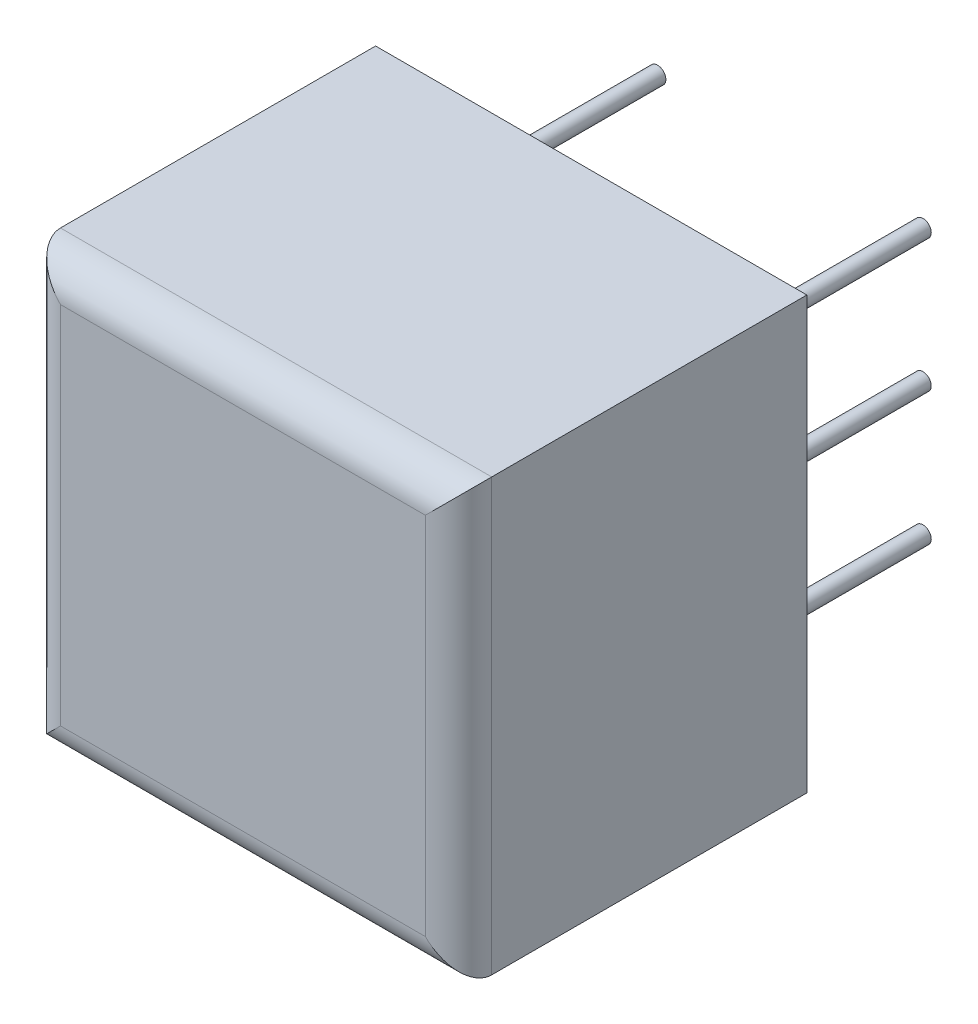
ISO-10303-21;
HEADER;
FILE_DESCRIPTION(('STEP AP214'),'2;1');
FILE_NAME('part.step','',(''),(''),'','','');
FILE_SCHEMA(('AUTOMOTIVE_DESIGN { 1 0 10303 214 1 1 1 1 }'));
ENDSEC;
DATA;
#1=APPLICATION_CONTEXT('core data for automotive mechanical design processes');
#2=APPLICATION_PROTOCOL_DEFINITION('international standard','automotive_design',2000,#1);
#3=PRODUCT_CONTEXT('',#1,'mechanical');
#4=PRODUCT('Part','Part','',(#3));
#5=PRODUCT_RELATED_PRODUCT_CATEGORY('part','',(#4));
#6=PRODUCT_DEFINITION_FORMATION('','',#4);
#7=PRODUCT_DEFINITION_CONTEXT('part definition',#1,'design');
#8=PRODUCT_DEFINITION('design','',#6,#7);
#9=PRODUCT_DEFINITION_SHAPE('','',#8);
#10=(LENGTH_UNIT() NAMED_UNIT(*) SI_UNIT(.MILLI.,.METRE.));
#11=(NAMED_UNIT(*) PLANE_ANGLE_UNIT() SI_UNIT($,.RADIAN.));
#12=(NAMED_UNIT(*) SI_UNIT($,.STERADIAN.) SOLID_ANGLE_UNIT());
#13=UNCERTAINTY_MEASURE_WITH_UNIT(LENGTH_MEASURE(1.E-05),#10,'distance_accuracy_value','');
#14=(GEOMETRIC_REPRESENTATION_CONTEXT(3) GLOBAL_UNCERTAINTY_ASSIGNED_CONTEXT((#13)) GLOBAL_UNIT_ASSIGNED_CONTEXT((#10,
#11,#12)) REPRESENTATION_CONTEXT('',''));
#15=CARTESIAN_POINT('',(0.,0.,0.));
#16=DIRECTION('',(0.,0.,1.));
#17=DIRECTION('',(1.,0.,0.));
#18=AXIS2_PLACEMENT_3D('',#15,#16,#17);
#19=CARTESIAN_POINT('',(0.,0.,0.));
#20=DIRECTION('',(0.,0.,1.));
#21=DIRECTION('',(1.,0.,0.));
#22=AXIS2_PLACEMENT_3D('',#19,#20,#21);
#23=PLANE('',#22);
#24=CARTESIAN_POINT('',(-8.,-8.,0.));
#25=DIRECTION('',(0.,0.,1.));
#26=DIRECTION('',(1.,0.,0.));
#27=AXIS2_PLACEMENT_3D('',#24,#25,#26);
#28=CIRCLE('',#27,0.500000000000001);
#29=CARTESIAN_POINT('',(-7.5,-8.,0.));
#30=VERTEX_POINT('',#29);
#31=EDGE_CURVE('E41',#30,#30,#28,.F.);
#32=ORIENTED_EDGE('',*,*,#31,.F.);
#33=EDGE_LOOP('',(#32));
#34=FACE_BOUND('',#33,.T.);
#35=CARTESIAN_POINT('',(8.,0.,0.));
#36=DIRECTION('',(0.,0.,1.));
#37=DIRECTION('',(1.,0.,0.));
#38=AXIS2_PLACEMENT_3D('',#35,#36,#37);
#39=CIRCLE('',#38,0.500000000000001);
#40=CARTESIAN_POINT('',(8.5,0.,0.));
#41=VERTEX_POINT('',#40);
#42=EDGE_CURVE('E145',#41,#41,#39,.F.);
#43=ORIENTED_EDGE('',*,*,#42,.F.);
#44=EDGE_LOOP('',(#43));
#45=FACE_BOUND('',#44,.T.);
#46=DIRECTION('',(0.,-1.,0.));
#47=VECTOR('',#46,1.);
#48=CARTESIAN_POINT('',(-13.,13.,0.));
#49=LINE('',#48,#47);
#50=CARTESIAN_POINT('',(-13.,13.,0.));
#51=VERTEX_POINT('',#50);
#52=CARTESIAN_POINT('',(-13.,-13.,0.));
#53=VERTEX_POINT('',#52);
#54=EDGE_CURVE('E98',#51,#53,#49,.T.);
#55=ORIENTED_EDGE('',*,*,#54,.F.);
#56=DIRECTION('',(-1.,0.,0.));
#57=VECTOR('',#56,1.);
#58=CARTESIAN_POINT('',(-13.,13.,0.));
#59=LINE('',#58,#57);
#60=CARTESIAN_POINT('',(13.,13.,0.));
#61=VERTEX_POINT('',#60);
#62=EDGE_CURVE('E115',#61,#51,#59,.T.);
#63=ORIENTED_EDGE('',*,*,#62,.F.);
#64=DIRECTION('',(0.,1.,0.));
#65=VECTOR('',#64,1.);
#66=CARTESIAN_POINT('',(13.,13.,0.));
#67=LINE('',#66,#65);
#68=CARTESIAN_POINT('',(13.,-13.,0.));
#69=VERTEX_POINT('',#68);
#70=EDGE_CURVE('E100',#69,#61,#67,.T.);
#71=ORIENTED_EDGE('',*,*,#70,.F.);
#72=DIRECTION('',(1.,0.,0.));
#73=VECTOR('',#72,1.);
#74=CARTESIAN_POINT('',(-13.,-13.,0.));
#75=LINE('',#74,#73);
#76=EDGE_CURVE('E88',#53,#69,#75,.T.);
#77=ORIENTED_EDGE('',*,*,#76,.F.);
#78=EDGE_LOOP('',(#55,#63,#71,#77));
#79=FACE_BOUND('',#78,.T.);
#80=CARTESIAN_POINT('',(8.,8.,0.));
#81=DIRECTION('',(0.,0.,1.));
#82=DIRECTION('',(1.,0.,0.));
#83=AXIS2_PLACEMENT_3D('',#80,#81,#82);
#84=CIRCLE('',#83,0.500000000000001);
#85=CARTESIAN_POINT('',(8.5,8.,0.));
#86=VERTEX_POINT('',#85);
#87=EDGE_CURVE('E136',#86,#86,#84,.F.);
#88=ORIENTED_EDGE('',*,*,#87,.F.);
#89=EDGE_LOOP('',(#88));
#90=FACE_BOUND('',#89,.T.);
#91=CARTESIAN_POINT('',(8.,-8.,0.));
#92=DIRECTION('',(0.,0.,1.));
#93=DIRECTION('',(1.,0.,0.));
#94=AXIS2_PLACEMENT_3D('',#91,#92,#93);
#95=CIRCLE('',#94,0.500000000000001);
#96=CARTESIAN_POINT('',(8.5,-8.,0.));
#97=VERTEX_POINT('',#96);
#98=EDGE_CURVE('E148',#97,#97,#95,.F.);
#99=ORIENTED_EDGE('',*,*,#98,.F.);
#100=EDGE_LOOP('',(#99));
#101=FACE_BOUND('',#100,.T.);
#102=CARTESIAN_POINT('',(-8.,8.,0.));
#103=DIRECTION('',(0.,0.,1.));
#104=DIRECTION('',(1.,0.,0.));
#105=AXIS2_PLACEMENT_3D('',#102,#103,#104);
#106=CIRCLE('',#105,0.500000000000001);
#107=CARTESIAN_POINT('',(-7.5,8.,0.));
#108=VERTEX_POINT('',#107);
#109=EDGE_CURVE('E11',#108,#108,#106,.F.);
#110=ORIENTED_EDGE('',*,*,#109,.F.);
#111=EDGE_LOOP('',(#110));
#112=FACE_BOUND('',#111,.T.);
#113=ADVANCED_FACE('F33',(#34,#45,#79,#90,#101,#112),#23,.F.);
#114=CARTESIAN_POINT('',(-13.,13.,21.));
#115=DIRECTION('',(1.,0.,0.));
#116=DIRECTION('',(0.,1.,0.));
#117=AXIS2_PLACEMENT_3D('',#114,#115,#116);
#118=PLANE('',#117);
#119=DIRECTION('',(0.,0.,-1.));
#120=VECTOR('',#119,1.);
#121=CARTESIAN_POINT('',(-13.,-13.,21.));
#122=LINE('',#121,#120);
#123=CARTESIAN_POINT('',(-13.,-13.,19.));
#124=VERTEX_POINT('',#123);
#125=EDGE_CURVE('E85',#124,#53,#122,.T.);
#126=ORIENTED_EDGE('',*,*,#125,.F.);
#127=DIRECTION('',(0.,-1.,0.));
#128=VECTOR('',#127,1.);
#129=CARTESIAN_POINT('',(-13.,13.,19.));
#130=LINE('',#129,#128);
#131=CARTESIAN_POINT('',(-13.,13.,19.));
#132=VERTEX_POINT('',#131);
#133=EDGE_CURVE('E55',#124,#132,#130,.F.);
#134=ORIENTED_EDGE('',*,*,#133,.T.);
#135=DIRECTION('',(0.,0.,-1.));
#136=VECTOR('',#135,1.);
#137=CARTESIAN_POINT('',(-13.,13.,21.));
#138=LINE('',#137,#136);
#139=EDGE_CURVE('E103',#132,#51,#138,.T.);
#140=ORIENTED_EDGE('',*,*,#139,.T.);
#141=ORIENTED_EDGE('',*,*,#54,.T.);
#142=EDGE_LOOP('',(#126,#134,#140,#141));
#143=FACE_BOUND('',#142,.T.);
#144=ADVANCED_FACE('F102',(#143),#118,.F.);
#145=CARTESIAN_POINT('',(-13.,-13.,21.));
#146=DIRECTION('',(0.,1.,0.));
#147=DIRECTION('',(-1.,0.,0.));
#148=AXIS2_PLACEMENT_3D('',#145,#146,#147);
#149=PLANE('',#148);
#150=DIRECTION('',(0.,0.,-1.));
#151=VECTOR('',#150,1.);
#152=CARTESIAN_POINT('',(13.,-13.,21.));
#153=LINE('',#152,#151);
#154=CARTESIAN_POINT('',(13.,-13.,19.));
#155=VERTEX_POINT('',#154);
#156=EDGE_CURVE('E92',#155,#69,#153,.T.);
#157=ORIENTED_EDGE('',*,*,#156,.F.);
#158=DIRECTION('',(1.,0.,0.));
#159=VECTOR('',#158,1.);
#160=CARTESIAN_POINT('',(-13.,-13.,19.));
#161=LINE('',#160,#159);
#162=EDGE_CURVE('E48',#155,#124,#161,.F.);
#163=ORIENTED_EDGE('',*,*,#162,.T.);
#164=ORIENTED_EDGE('',*,*,#125,.T.);
#165=ORIENTED_EDGE('',*,*,#76,.T.);
#166=EDGE_LOOP('',(#157,#163,#164,#165));
#167=FACE_BOUND('',#166,.T.);
#168=ADVANCED_FACE('F87',(#167),#149,.F.);
#169=CARTESIAN_POINT('',(13.,13.,21.));
#170=DIRECTION('',(-1.,0.,0.));
#171=DIRECTION('',(0.,-1.,0.));
#172=AXIS2_PLACEMENT_3D('',#169,#170,#171);
#173=PLANE('',#172);
#174=DIRECTION('',(0.,0.,-1.));
#175=VECTOR('',#174,1.);
#176=CARTESIAN_POINT('',(13.,13.,21.));
#177=LINE('',#176,#175);
#178=CARTESIAN_POINT('',(13.,13.,19.));
#179=VERTEX_POINT('',#178);
#180=EDGE_CURVE('E118',#179,#61,#177,.T.);
#181=ORIENTED_EDGE('',*,*,#180,.F.);
#182=DIRECTION('',(0.,1.,0.));
#183=VECTOR('',#182,1.);
#184=CARTESIAN_POINT('',(13.,-13.,19.));
#185=LINE('',#184,#183);
#186=EDGE_CURVE('E129',#179,#155,#185,.F.);
#187=ORIENTED_EDGE('',*,*,#186,.T.);
#188=ORIENTED_EDGE('',*,*,#156,.T.);
#189=ORIENTED_EDGE('',*,*,#70,.T.);
#190=EDGE_LOOP('',(#181,#187,#188,#189));
#191=FACE_BOUND('',#190,.T.);
#192=ADVANCED_FACE('F190',(#191),#173,.F.);
#193=CARTESIAN_POINT('',(-13.,13.,21.));
#194=DIRECTION('',(0.,-1.,0.));
#195=DIRECTION('',(1.,0.,0.));
#196=AXIS2_PLACEMENT_3D('',#193,#194,#195);
#197=PLANE('',#196);
#198=ORIENTED_EDGE('',*,*,#139,.F.);
#199=DIRECTION('',(-1.,0.,0.));
#200=VECTOR('',#199,1.);
#201=CARTESIAN_POINT('',(13.,13.,19.));
#202=LINE('',#201,#200);
#203=EDGE_CURVE('E132',#132,#179,#202,.F.);
#204=ORIENTED_EDGE('',*,*,#203,.T.);
#205=ORIENTED_EDGE('',*,*,#180,.T.);
#206=ORIENTED_EDGE('',*,*,#62,.T.);
#207=EDGE_LOOP('',(#198,#204,#205,#206));
#208=FACE_BOUND('',#207,.T.);
#209=ADVANCED_FACE('F185',(#208),#197,.F.);
#210=CARTESIAN_POINT('',(0.,0.,21.));
#211=DIRECTION('',(0.,0.,1.));
#212=DIRECTION('',(1.,0.,0.));
#213=AXIS2_PLACEMENT_3D('',#210,#211,#212);
#214=PLANE('',#213);
#215=DIRECTION('',(1.,0.,0.));
#216=VECTOR('',#215,1.);
#217=CARTESIAN_POINT('',(13.,-11.,21.));
#218=LINE('',#217,#216);
#219=CARTESIAN_POINT('',(-11.,-11.,21.));
#220=VERTEX_POINT('',#219);
#221=CARTESIAN_POINT('',(11.,-11.,21.));
#222=VERTEX_POINT('',#221);
#223=EDGE_CURVE('E91',#220,#222,#218,.T.);
#224=ORIENTED_EDGE('',*,*,#223,.T.);
#225=DIRECTION('',(0.,1.,0.));
#226=VECTOR('',#225,1.);
#227=CARTESIAN_POINT('',(11.,13.,21.));
#228=LINE('',#227,#226);
#229=CARTESIAN_POINT('',(11.,11.,21.));
#230=VERTEX_POINT('',#229);
#231=EDGE_CURVE('E126',#222,#230,#228,.T.);
#232=ORIENTED_EDGE('',*,*,#231,.T.);
#233=DIRECTION('',(-1.,0.,0.));
#234=VECTOR('',#233,1.);
#235=CARTESIAN_POINT('',(-13.,11.,21.));
#236=LINE('',#235,#234);
#237=CARTESIAN_POINT('',(-11.,11.,21.));
#238=VERTEX_POINT('',#237);
#239=EDGE_CURVE('E124',#230,#238,#236,.T.);
#240=ORIENTED_EDGE('',*,*,#239,.T.);
#241=DIRECTION('',(0.,-1.,0.));
#242=VECTOR('',#241,1.);
#243=CARTESIAN_POINT('',(-11.,-13.,21.));
#244=LINE('',#243,#242);
#245=EDGE_CURVE('E122',#238,#220,#244,.T.);
#246=ORIENTED_EDGE('',*,*,#245,.T.);
#247=EDGE_LOOP('',(#224,#232,#240,#246));
#248=FACE_BOUND('',#247,.T.);
#249=ADVANCED_FACE('F183',(#248),#214,.T.);
#250=CARTESIAN_POINT('',(-11.,0.,19.));
#251=DIRECTION('',(0.,1.,0.));
#252=DIRECTION('',(-1.,0.,0.));
#253=AXIS2_PLACEMENT_3D('',#250,#251,#252);
#254=CYLINDRICAL_SURFACE('',#253,2.);
#255=CARTESIAN_POINT('',(-11.,11.,19.));
#256=DIRECTION('',(0.707106781186547,0.707106781186548,0.));
#257=DIRECTION('',(-0.707106781186548,0.707106781186547,0.));
#258=AXIS2_PLACEMENT_3D('',#255,#256,#257);
#259=ELLIPSE('',#258,2.82842712474619,2.);
#260=EDGE_CURVE('E108',#132,#238,#259,.T.);
#261=ORIENTED_EDGE('',*,*,#260,.F.);
#262=ORIENTED_EDGE('',*,*,#133,.F.);
#263=CARTESIAN_POINT('',(-11.,-11.,19.));
#264=DIRECTION('',(-0.707106781186548,0.707106781186547,0.));
#265=DIRECTION('',(-0.707106781186547,-0.707106781186548,0.));
#266=AXIS2_PLACEMENT_3D('',#263,#264,#265);
#267=ELLIPSE('',#266,2.82842712474619,2.);
#268=EDGE_CURVE('E105',#220,#124,#267,.F.);
#269=ORIENTED_EDGE('',*,*,#268,.F.);
#270=ORIENTED_EDGE('',*,*,#245,.F.);
#271=EDGE_LOOP('',(#261,#262,#269,#270));
#272=FACE_BOUND('',#271,.T.);
#273=ADVANCED_FACE('F35',(#272),#254,.T.);
#274=CARTESIAN_POINT('',(0.,-11.,19.));
#275=DIRECTION('',(-1.,0.,0.));
#276=DIRECTION('',(0.,-1.,0.));
#277=AXIS2_PLACEMENT_3D('',#274,#275,#276);
#278=CYLINDRICAL_SURFACE('',#277,2.);
#279=ORIENTED_EDGE('',*,*,#268,.T.);
#280=ORIENTED_EDGE('',*,*,#162,.F.);
#281=CARTESIAN_POINT('',(11.,-11.,19.));
#282=DIRECTION('',(-0.707106781186547,-0.707106781186548,0.));
#283=DIRECTION('',(-0.707106781186548,0.707106781186547,0.));
#284=AXIS2_PLACEMENT_3D('',#281,#282,#283);
#285=ELLIPSE('',#284,2.82842712474619,2.);
#286=EDGE_CURVE('E139',#222,#155,#285,.F.);
#287=ORIENTED_EDGE('',*,*,#286,.F.);
#288=ORIENTED_EDGE('',*,*,#223,.F.);
#289=EDGE_LOOP('',(#279,#280,#287,#288));
#290=FACE_BOUND('',#289,.T.);
#291=ADVANCED_FACE('F204',(#290),#278,.T.);
#292=CARTESIAN_POINT('',(0.,11.,19.));
#293=DIRECTION('',(1.,0.,0.));
#294=DIRECTION('',(0.,1.,0.));
#295=AXIS2_PLACEMENT_3D('',#292,#293,#294);
#296=CYLINDRICAL_SURFACE('',#295,2.);
#297=ORIENTED_EDGE('',*,*,#260,.T.);
#298=ORIENTED_EDGE('',*,*,#239,.F.);
#299=CARTESIAN_POINT('',(11.,11.,19.));
#300=DIRECTION('',(0.707106781186548,-0.707106781186547,0.));
#301=DIRECTION('',(0.707106781186547,0.707106781186548,0.));
#302=AXIS2_PLACEMENT_3D('',#299,#300,#301);
#303=ELLIPSE('',#302,2.82842712474619,2.);
#304=EDGE_CURVE('E137',#179,#230,#303,.T.);
#305=ORIENTED_EDGE('',*,*,#304,.F.);
#306=ORIENTED_EDGE('',*,*,#203,.F.);
#307=EDGE_LOOP('',(#297,#298,#305,#306));
#308=FACE_BOUND('',#307,.T.);
#309=ADVANCED_FACE('F201',(#308),#296,.T.);
#310=CARTESIAN_POINT('',(11.,0.,19.));
#311=DIRECTION('',(0.,-1.,0.));
#312=DIRECTION('',(1.,0.,0.));
#313=AXIS2_PLACEMENT_3D('',#310,#311,#312);
#314=CYLINDRICAL_SURFACE('',#313,2.);
#315=ORIENTED_EDGE('',*,*,#286,.T.);
#316=ORIENTED_EDGE('',*,*,#186,.F.);
#317=ORIENTED_EDGE('',*,*,#304,.T.);
#318=ORIENTED_EDGE('',*,*,#231,.F.);
#319=EDGE_LOOP('',(#315,#316,#317,#318));
#320=FACE_BOUND('',#319,.T.);
#321=ADVANCED_FACE('F181',(#320),#314,.T.);
#322=CARTESIAN_POINT('',(8.,8.,-12.));
#323=DIRECTION('',(0.,0.,1.));
#324=DIRECTION('',(1.,0.,0.));
#325=AXIS2_PLACEMENT_3D('',#322,#323,#324);
#326=CYLINDRICAL_SURFACE('',#325,0.500000000000001);
#327=CARTESIAN_POINT('',(8.,8.,-12.));
#328=DIRECTION('',(0.,0.,-1.));
#329=DIRECTION('',(-1.,0.,0.));
#330=AXIS2_PLACEMENT_3D('',#327,#328,#329);
#331=CIRCLE('',#330,0.500000000000001);
#332=CARTESIAN_POINT('',(7.5,8.,-12.));
#333=VERTEX_POINT('',#332);
#334=EDGE_CURVE('E111',#333,#333,#331,.T.);
#335=ORIENTED_EDGE('',*,*,#334,.F.);
#336=EDGE_LOOP('',(#335));
#337=FACE_BOUND('',#336,.T.);
#338=ORIENTED_EDGE('',*,*,#87,.T.);
#339=EDGE_LOOP('',(#338));
#340=FACE_BOUND('',#339,.T.);
#341=ADVANCED_FACE('F173',(#337,#340),#326,.T.);
#342=CARTESIAN_POINT('',(8.,8.,-12.));
#343=DIRECTION('',(0.,0.,-1.));
#344=DIRECTION('',(-1.,0.,0.));
#345=AXIS2_PLACEMENT_3D('',#342,#343,#344);
#346=PLANE('',#345);
#347=ORIENTED_EDGE('',*,*,#334,.T.);
#348=EDGE_LOOP('',(#347));
#349=FACE_BOUND('',#348,.T.);
#350=ADVANCED_FACE('F163',(#349),#346,.T.);
#351=CARTESIAN_POINT('',(8.,0.,-12.));
#352=DIRECTION('',(0.,0.,1.));
#353=DIRECTION('',(1.,0.,0.));
#354=AXIS2_PLACEMENT_3D('',#351,#352,#353);
#355=CYLINDRICAL_SURFACE('',#354,0.500000000000001);
#356=CARTESIAN_POINT('',(8.,0.,-12.));
#357=DIRECTION('',(0.,0.,-1.));
#358=DIRECTION('',(-1.,0.,0.));
#359=AXIS2_PLACEMENT_3D('',#356,#357,#358);
#360=CIRCLE('',#359,0.500000000000001);
#361=CARTESIAN_POINT('',(7.5,0.,-12.));
#362=VERTEX_POINT('',#361);
#363=EDGE_CURVE('E366',#362,#362,#360,.T.);
#364=ORIENTED_EDGE('',*,*,#363,.F.);
#365=EDGE_LOOP('',(#364));
#366=FACE_BOUND('',#365,.T.);
#367=ORIENTED_EDGE('',*,*,#42,.T.);
#368=EDGE_LOOP('',(#367));
#369=FACE_BOUND('',#368,.T.);
#370=ADVANCED_FACE('F160',(#366,#369),#355,.T.);
#371=CARTESIAN_POINT('',(8.,0.,-12.));
#372=DIRECTION('',(0.,0.,-1.));
#373=DIRECTION('',(-1.,0.,0.));
#374=AXIS2_PLACEMENT_3D('',#371,#372,#373);
#375=PLANE('',#374);
#376=ORIENTED_EDGE('',*,*,#363,.T.);
#377=EDGE_LOOP('',(#376));
#378=FACE_BOUND('',#377,.T.);
#379=ADVANCED_FACE('F162',(#378),#375,.T.);
#380=CARTESIAN_POINT('',(8.,-8.,-12.));
#381=DIRECTION('',(0.,0.,1.));
#382=DIRECTION('',(1.,0.,0.));
#383=AXIS2_PLACEMENT_3D('',#380,#381,#382);
#384=CYLINDRICAL_SURFACE('',#383,0.500000000000001);
#385=CARTESIAN_POINT('',(8.,-8.,-12.));
#386=DIRECTION('',(0.,0.,-1.));
#387=DIRECTION('',(1.,0.,0.));
#388=AXIS2_PLACEMENT_3D('',#385,#386,#387);
#389=CIRCLE('',#388,0.500000000000001);
#390=CARTESIAN_POINT('',(8.5,-8.,-12.));
#391=VERTEX_POINT('',#390);
#392=EDGE_CURVE('E362',#391,#391,#389,.T.);
#393=ORIENTED_EDGE('',*,*,#392,.F.);
#394=EDGE_LOOP('',(#393));
#395=FACE_BOUND('',#394,.T.);
#396=ORIENTED_EDGE('',*,*,#98,.T.);
#397=EDGE_LOOP('',(#396));
#398=FACE_BOUND('',#397,.T.);
#399=ADVANCED_FACE('F170',(#395,#398),#384,.T.);
#400=CARTESIAN_POINT('',(8.,-8.,-12.));
#401=DIRECTION('',(0.,0.,1.));
#402=DIRECTION('',(1.,0.,0.));
#403=AXIS2_PLACEMENT_3D('',#400,#401,#402);
#404=PLANE('',#403);
#405=ORIENTED_EDGE('',*,*,#392,.T.);
#406=EDGE_LOOP('',(#405));
#407=FACE_BOUND('',#406,.T.);
#408=ADVANCED_FACE('F304',(#407),#404,.F.);
#409=CARTESIAN_POINT('',(-8.,-8.,-12.));
#410=DIRECTION('',(0.,0.,1.));
#411=DIRECTION('',(1.,0.,0.));
#412=AXIS2_PLACEMENT_3D('',#409,#410,#411);
#413=CYLINDRICAL_SURFACE('',#412,0.500000000000001);
#414=CARTESIAN_POINT('',(-8.,-8.,-12.));
#415=DIRECTION('',(0.,0.,-1.));
#416=DIRECTION('',(-1.,0.,0.));
#417=AXIS2_PLACEMENT_3D('',#414,#415,#416);
#418=CIRCLE('',#417,0.500000000000001);
#419=CARTESIAN_POINT('',(-8.5,-8.,-12.));
#420=VERTEX_POINT('',#419);
#421=EDGE_CURVE('E359',#420,#420,#418,.T.);
#422=ORIENTED_EDGE('',*,*,#421,.F.);
#423=EDGE_LOOP('',(#422));
#424=FACE_BOUND('',#423,.T.);
#425=ORIENTED_EDGE('',*,*,#31,.T.);
#426=EDGE_LOOP('',(#425));
#427=FACE_BOUND('',#426,.T.);
#428=ADVANCED_FACE('F153',(#424,#427),#413,.T.);
#429=CARTESIAN_POINT('',(-8.,-8.,-12.));
#430=DIRECTION('',(0.,0.,-1.));
#431=DIRECTION('',(-1.,0.,0.));
#432=AXIS2_PLACEMENT_3D('',#429,#430,#431);
#433=PLANE('',#432);
#434=ORIENTED_EDGE('',*,*,#421,.T.);
#435=EDGE_LOOP('',(#434));
#436=FACE_BOUND('',#435,.T.);
#437=ADVANCED_FACE('F320',(#436),#433,.T.);
#438=CARTESIAN_POINT('',(-8.,8.,-12.));
#439=DIRECTION('',(0.,0.,1.));
#440=DIRECTION('',(1.,0.,0.));
#441=AXIS2_PLACEMENT_3D('',#438,#439,#440);
#442=CYLINDRICAL_SURFACE('',#441,0.500000000000001);
#443=CARTESIAN_POINT('',(-8.,8.,-12.));
#444=DIRECTION('',(0.,0.,-1.));
#445=DIRECTION('',(1.,0.,0.));
#446=AXIS2_PLACEMENT_3D('',#443,#444,#445);
#447=CIRCLE('',#446,0.500000000000001);
#448=CARTESIAN_POINT('',(-7.5,8.,-12.));
#449=VERTEX_POINT('',#448);
#450=EDGE_CURVE('E358',#449,#449,#447,.T.);
#451=ORIENTED_EDGE('',*,*,#450,.F.);
#452=EDGE_LOOP('',(#451));
#453=FACE_BOUND('',#452,.T.);
#454=ORIENTED_EDGE('',*,*,#109,.T.);
#455=EDGE_LOOP('',(#454));
#456=FACE_BOUND('',#455,.T.);
#457=ADVANCED_FACE('F329',(#453,#456),#442,.T.);
#458=CARTESIAN_POINT('',(-8.,8.,-12.));
#459=DIRECTION('',(0.,0.,1.));
#460=DIRECTION('',(1.,0.,0.));
#461=AXIS2_PLACEMENT_3D('',#458,#459,#460);
#462=PLANE('',#461);
#463=ORIENTED_EDGE('',*,*,#450,.T.);
#464=EDGE_LOOP('',(#463));
#465=FACE_BOUND('',#464,.T.);
#466=ADVANCED_FACE('F338',(#465),#462,.F.);
#467=CLOSED_SHELL('',(#113,#144,#168,#192,#209,#249,#273,#291,#309,#321,#341,#350,#370,#379,
#399,#408,#428,#437,#457,#466));
#468=MANIFOLD_SOLID_BREP('B2',#467);
#469=ADVANCED_BREP_SHAPE_REPRESENTATION('',(#18,#468),#14);
#470=SHAPE_DEFINITION_REPRESENTATION(#9,#469);
ENDSEC;
END-ISO-10303-21;
